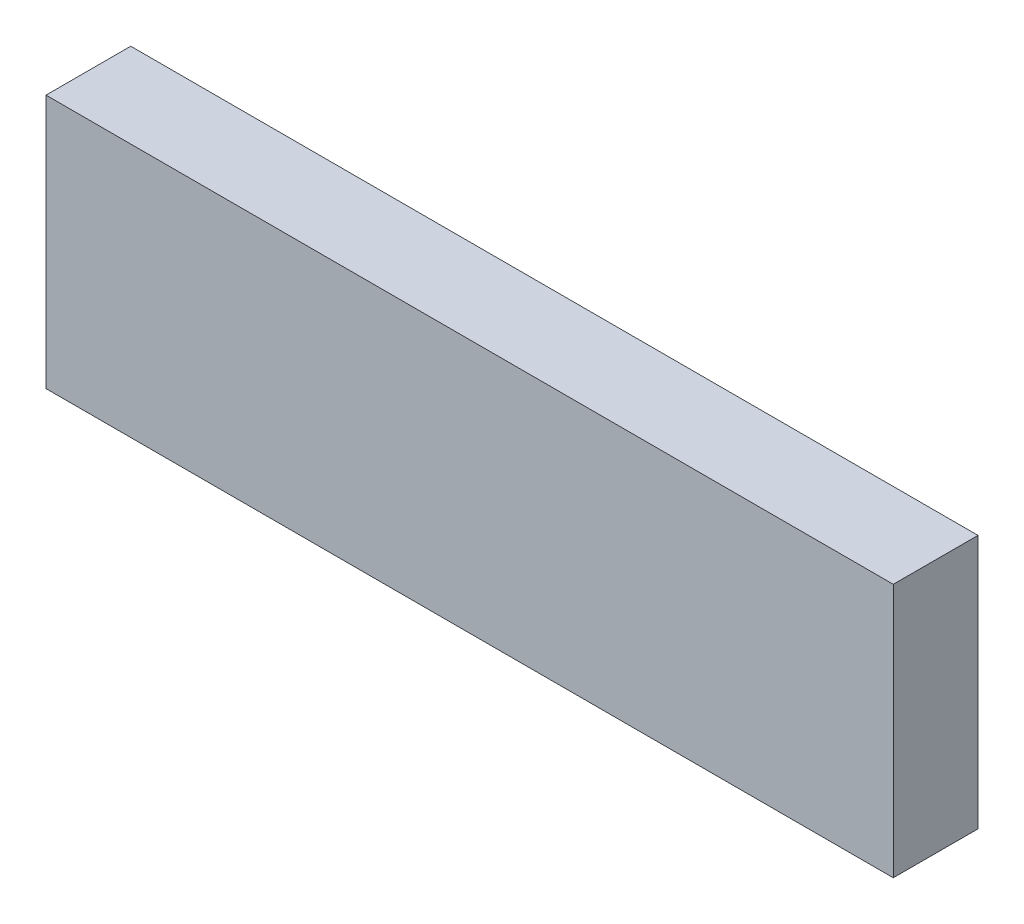
ISO-10303-21;
HEADER;
FILE_DESCRIPTION(('STEP AP214'),'2;1');
FILE_NAME('part.step','',(''),(''),'','','');
FILE_SCHEMA(('AUTOMOTIVE_DESIGN { 1 0 10303 214 1 1 1 1 }'));
ENDSEC;
DATA;
#1=APPLICATION_CONTEXT('core data for automotive mechanical design processes');
#2=APPLICATION_PROTOCOL_DEFINITION('international standard','automotive_design',2000,#1);
#3=PRODUCT_CONTEXT('',#1,'mechanical');
#4=PRODUCT('Part','Part','',(#3));
#5=PRODUCT_RELATED_PRODUCT_CATEGORY('part','',(#4));
#6=PRODUCT_DEFINITION_FORMATION('','',#4);
#7=PRODUCT_DEFINITION_CONTEXT('part definition',#1,'design');
#8=PRODUCT_DEFINITION('design','',#6,#7);
#9=PRODUCT_DEFINITION_SHAPE('','',#8);
#10=(LENGTH_UNIT() NAMED_UNIT(*) SI_UNIT(.MILLI.,.METRE.));
#11=(NAMED_UNIT(*) PLANE_ANGLE_UNIT() SI_UNIT($,.RADIAN.));
#12=(NAMED_UNIT(*) SI_UNIT($,.STERADIAN.) SOLID_ANGLE_UNIT());
#13=UNCERTAINTY_MEASURE_WITH_UNIT(LENGTH_MEASURE(1.E-05),#10,'distance_accuracy_value','');
#14=(GEOMETRIC_REPRESENTATION_CONTEXT(3) GLOBAL_UNCERTAINTY_ASSIGNED_CONTEXT((#13)) GLOBAL_UNIT_ASSIGNED_CONTEXT((#10,
#11,#12)) REPRESENTATION_CONTEXT('',''));
#15=CARTESIAN_POINT('',(0.,0.,0.));
#16=DIRECTION('',(0.,0.,1.));
#17=DIRECTION('',(1.,0.,0.));
#18=AXIS2_PLACEMENT_3D('',#15,#16,#17);
#19=CARTESIAN_POINT('',(0.,0.,20.));
#20=DIRECTION('',(1.,0.,0.));
#21=DIRECTION('',(0.,1.,0.));
#22=AXIS2_PLACEMENT_3D('',#19,#20,#21);
#23=PLANE('',#22);
#24=DIRECTION('',(0.,-1.,0.));
#25=VECTOR('',#24,1.);
#26=CARTESIAN_POINT('',(0.,0.,0.));
#27=LINE('',#26,#25);
#28=CARTESIAN_POINT('',(0.,60.,0.));
#29=VERTEX_POINT('',#28);
#30=CARTESIAN_POINT('',(0.,0.,0.));
#31=VERTEX_POINT('',#30);
#32=EDGE_CURVE('E98',#29,#31,#27,.T.);
#33=ORIENTED_EDGE('',*,*,#32,.T.);
#34=DIRECTION('',(0.,0.,-1.));
#35=VECTOR('',#34,1.);
#36=CARTESIAN_POINT('',(0.,0.,20.));
#37=LINE('',#36,#35);
#38=CARTESIAN_POINT('',(0.,0.,20.));
#39=VERTEX_POINT('',#38);
#40=EDGE_CURVE('E11',#39,#31,#37,.T.);
#41=ORIENTED_EDGE('',*,*,#40,.F.);
#42=DIRECTION('',(0.,-1.,0.));
#43=VECTOR('',#42,1.);
#44=CARTESIAN_POINT('',(0.,0.,20.));
#45=LINE('',#44,#43);
#46=CARTESIAN_POINT('',(0.,60.,20.));
#47=VERTEX_POINT('',#46);
#48=EDGE_CURVE('E86',#47,#39,#45,.T.);
#49=ORIENTED_EDGE('',*,*,#48,.F.);
#50=DIRECTION('',(0.,0.,-1.));
#51=VECTOR('',#50,1.);
#52=CARTESIAN_POINT('',(0.,60.,20.));
#53=LINE('',#52,#51);
#54=EDGE_CURVE('E94',#47,#29,#53,.T.);
#55=ORIENTED_EDGE('',*,*,#54,.T.);
#56=EDGE_LOOP('',(#33,#41,#49,#55));
#57=FACE_BOUND('',#56,.T.);
#58=ADVANCED_FACE('F35',(#57),#23,.F.);
#59=CARTESIAN_POINT('',(0.,0.,20.));
#60=DIRECTION('',(0.,1.,0.));
#61=DIRECTION('',(0.,0.,1.));
#62=AXIS2_PLACEMENT_3D('',#59,#60,#61);
#63=PLANE('',#62);
#64=DIRECTION('',(1.,0.,0.));
#65=VECTOR('',#64,1.);
#66=CARTESIAN_POINT('',(0.,0.,0.));
#67=LINE('',#66,#65);
#68=CARTESIAN_POINT('',(200.,0.,0.));
#69=VERTEX_POINT('',#68);
#70=EDGE_CURVE('E90',#31,#69,#67,.T.);
#71=ORIENTED_EDGE('',*,*,#70,.T.);
#72=DIRECTION('',(0.,0.,-1.));
#73=VECTOR('',#72,1.);
#74=CARTESIAN_POINT('',(200.,0.,20.));
#75=LINE('',#74,#73);
#76=CARTESIAN_POINT('',(200.,0.,20.));
#77=VERTEX_POINT('',#76);
#78=EDGE_CURVE('E43',#77,#69,#75,.T.);
#79=ORIENTED_EDGE('',*,*,#78,.F.);
#80=DIRECTION('',(1.,0.,0.));
#81=VECTOR('',#80,1.);
#82=CARTESIAN_POINT('',(0.,0.,20.));
#83=LINE('',#82,#81);
#84=EDGE_CURVE('E81',#39,#77,#83,.T.);
#85=ORIENTED_EDGE('',*,*,#84,.F.);
#86=ORIENTED_EDGE('',*,*,#40,.T.);
#87=EDGE_LOOP('',(#71,#79,#85,#86));
#88=FACE_BOUND('',#87,.T.);
#89=ADVANCED_FACE('F89',(#88),#63,.F.);
#90=CARTESIAN_POINT('',(200.,0.,20.));
#91=DIRECTION('',(-1.,0.,0.));
#92=DIRECTION('',(0.,-1.,0.));
#93=AXIS2_PLACEMENT_3D('',#90,#91,#92);
#94=PLANE('',#93);
#95=DIRECTION('',(0.,1.,0.));
#96=VECTOR('',#95,1.);
#97=CARTESIAN_POINT('',(200.,0.,0.));
#98=LINE('',#97,#96);
#99=CARTESIAN_POINT('',(200.,60.,0.));
#100=VERTEX_POINT('',#99);
#101=EDGE_CURVE('E68',#69,#100,#98,.T.);
#102=ORIENTED_EDGE('',*,*,#101,.T.);
#103=DIRECTION('',(0.,0.,-1.));
#104=VECTOR('',#103,1.);
#105=CARTESIAN_POINT('',(200.,60.,20.));
#106=LINE('',#105,#104);
#107=CARTESIAN_POINT('',(200.,60.,20.));
#108=VERTEX_POINT('',#107);
#109=EDGE_CURVE('E91',#108,#100,#106,.T.);
#110=ORIENTED_EDGE('',*,*,#109,.F.);
#111=DIRECTION('',(0.,1.,0.));
#112=VECTOR('',#111,1.);
#113=CARTESIAN_POINT('',(200.,0.,20.));
#114=LINE('',#113,#112);
#115=EDGE_CURVE('E84',#77,#108,#114,.T.);
#116=ORIENTED_EDGE('',*,*,#115,.F.);
#117=ORIENTED_EDGE('',*,*,#78,.T.);
#118=EDGE_LOOP('',(#102,#110,#116,#117));
#119=FACE_BOUND('',#118,.T.);
#120=ADVANCED_FACE('F92',(#119),#94,.F.);
#121=CARTESIAN_POINT('',(0.,60.,20.));
#122=DIRECTION('',(0.,-1.,0.));
#123=DIRECTION('',(0.,0.,-1.));
#124=AXIS2_PLACEMENT_3D('',#121,#122,#123);
#125=PLANE('',#124);
#126=DIRECTION('',(-1.,0.,0.));
#127=VECTOR('',#126,1.);
#128=CARTESIAN_POINT('',(0.,60.,0.));
#129=LINE('',#128,#127);
#130=EDGE_CURVE('E74',#100,#29,#129,.T.);
#131=ORIENTED_EDGE('',*,*,#130,.T.);
#132=ORIENTED_EDGE('',*,*,#54,.F.);
#133=DIRECTION('',(-1.,0.,0.));
#134=VECTOR('',#133,1.);
#135=CARTESIAN_POINT('',(0.,60.,20.));
#136=LINE('',#135,#134);
#137=EDGE_CURVE('E51',#108,#47,#136,.T.);
#138=ORIENTED_EDGE('',*,*,#137,.F.);
#139=ORIENTED_EDGE('',*,*,#109,.T.);
#140=EDGE_LOOP('',(#131,#132,#138,#139));
#141=FACE_BOUND('',#140,.T.);
#142=ADVANCED_FACE('F105',(#141),#125,.F.);
#143=CARTESIAN_POINT('',(0.,0.,20.));
#144=DIRECTION('',(0.,0.,-1.));
#145=DIRECTION('',(-1.,0.,0.));
#146=AXIS2_PLACEMENT_3D('',#143,#144,#145);
#147=PLANE('',#146);
#148=ORIENTED_EDGE('',*,*,#48,.T.);
#149=ORIENTED_EDGE('',*,*,#84,.T.);
#150=ORIENTED_EDGE('',*,*,#115,.T.);
#151=ORIENTED_EDGE('',*,*,#137,.T.);
#152=EDGE_LOOP('',(#148,#149,#150,#151));
#153=FACE_BOUND('',#152,.T.);
#154=ADVANCED_FACE('F82',(#153),#147,.F.);
#155=CARTESIAN_POINT('',(0.,0.,0.));
#156=DIRECTION('',(0.,0.,-1.));
#157=DIRECTION('',(-1.,0.,0.));
#158=AXIS2_PLACEMENT_3D('',#155,#156,#157);
#159=PLANE('',#158);
#160=ORIENTED_EDGE('',*,*,#32,.F.);
#161=ORIENTED_EDGE('',*,*,#130,.F.);
#162=ORIENTED_EDGE('',*,*,#101,.F.);
#163=ORIENTED_EDGE('',*,*,#70,.F.);
#164=EDGE_LOOP('',(#160,#161,#162,#163));
#165=FACE_BOUND('',#164,.T.);
#166=ADVANCED_FACE('F108',(#165),#159,.T.);
#167=CLOSED_SHELL('',(#58,#89,#120,#142,#154,#166));
#168=MANIFOLD_SOLID_BREP('B2',#167);
#169=ADVANCED_BREP_SHAPE_REPRESENTATION('',(#18,#168),#14);
#170=SHAPE_DEFINITION_REPRESENTATION(#9,#169);
ENDSEC;
END-ISO-10303-21;
